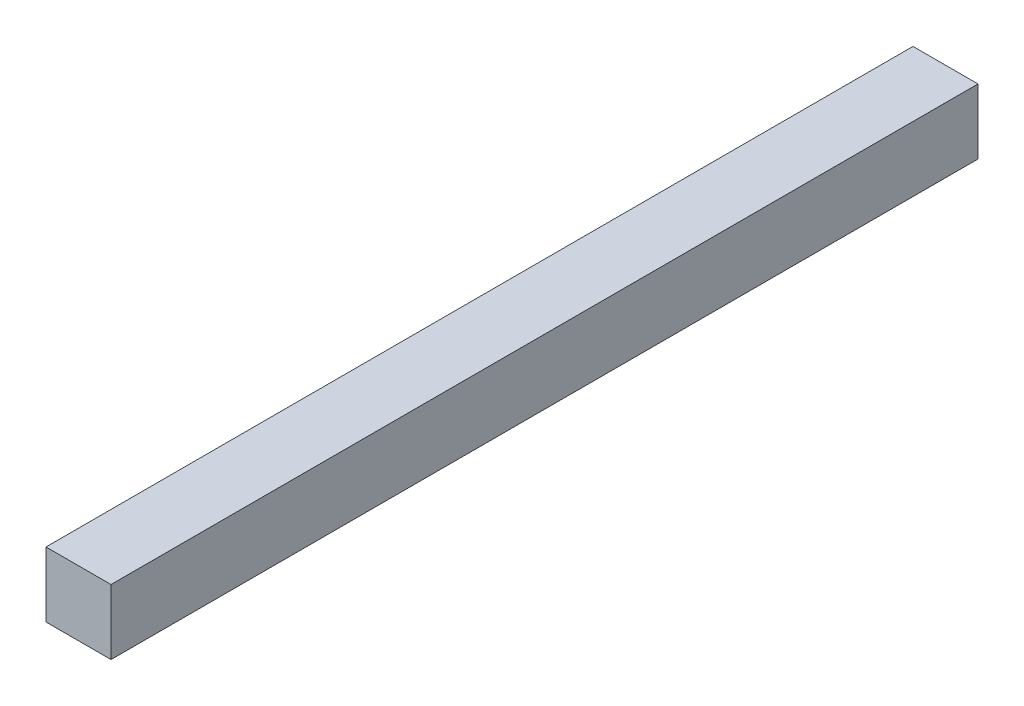
ISO-10303-21;
HEADER;
FILE_DESCRIPTION(('STEP AP214'),'2;1');
FILE_NAME('part.step','',(''),(''),'','','');
FILE_SCHEMA(('AUTOMOTIVE_DESIGN { 1 0 10303 214 1 1 1 1 }'));
ENDSEC;
DATA;
#1=APPLICATION_CONTEXT('core data for automotive mechanical design processes');
#2=APPLICATION_PROTOCOL_DEFINITION('international standard','automotive_design',2000,#1);
#3=PRODUCT_CONTEXT('',#1,'mechanical');
#4=PRODUCT('Part','Part','',(#3));
#5=PRODUCT_RELATED_PRODUCT_CATEGORY('part','',(#4));
#6=PRODUCT_DEFINITION_FORMATION('','',#4);
#7=PRODUCT_DEFINITION_CONTEXT('part definition',#1,'design');
#8=PRODUCT_DEFINITION('design','',#6,#7);
#9=PRODUCT_DEFINITION_SHAPE('','',#8);
#10=(LENGTH_UNIT() NAMED_UNIT(*) SI_UNIT(.MILLI.,.METRE.));
#11=(NAMED_UNIT(*) PLANE_ANGLE_UNIT() SI_UNIT($,.RADIAN.));
#12=(NAMED_UNIT(*) SI_UNIT($,.STERADIAN.) SOLID_ANGLE_UNIT());
#13=UNCERTAINTY_MEASURE_WITH_UNIT(LENGTH_MEASURE(1.E-05),#10,'distance_accuracy_value','');
#14=(GEOMETRIC_REPRESENTATION_CONTEXT(3) GLOBAL_UNCERTAINTY_ASSIGNED_CONTEXT((#13)) GLOBAL_UNIT_ASSIGNED_CONTEXT((#10,
#11,#12)) REPRESENTATION_CONTEXT('',''));
#15=CARTESIAN_POINT('',(0.,0.,0.));
#16=DIRECTION('',(0.,0.,1.));
#17=DIRECTION('',(1.,0.,0.));
#18=AXIS2_PLACEMENT_3D('',#15,#16,#17);
#19=CARTESIAN_POINT('',(15.,15.,200.));
#20=DIRECTION('',(-1.,0.,0.));
#21=DIRECTION('',(0.,0.,1.));
#22=AXIS2_PLACEMENT_3D('',#19,#20,#21);
#23=PLANE('',#22);
#24=DIRECTION('',(0.,1.,0.));
#25=VECTOR('',#24,1.);
#26=CARTESIAN_POINT('',(15.,15.,-200.));
#27=LINE('',#26,#25);
#28=CARTESIAN_POINT('',(15.,-15.,-200.));
#29=VERTEX_POINT('',#28);
#30=CARTESIAN_POINT('',(15.,15.,-200.));
#31=VERTEX_POINT('',#30);
#32=EDGE_CURVE('E98',#29,#31,#27,.T.);
#33=ORIENTED_EDGE('',*,*,#32,.T.);
#34=DIRECTION('',(0.,0.,-1.));
#35=VECTOR('',#34,1.);
#36=CARTESIAN_POINT('',(15.,15.,200.));
#37=LINE('',#36,#35);
#38=CARTESIAN_POINT('',(15.,15.,200.));
#39=VERTEX_POINT('',#38);
#40=EDGE_CURVE('E11',#39,#31,#37,.T.);
#41=ORIENTED_EDGE('',*,*,#40,.F.);
#42=DIRECTION('',(0.,1.,0.));
#43=VECTOR('',#42,1.);
#44=CARTESIAN_POINT('',(15.,15.,200.));
#45=LINE('',#44,#43);
#46=CARTESIAN_POINT('',(15.,-15.,200.));
#47=VERTEX_POINT('',#46);
#48=EDGE_CURVE('E86',#47,#39,#45,.T.);
#49=ORIENTED_EDGE('',*,*,#48,.F.);
#50=DIRECTION('',(0.,0.,-1.));
#51=VECTOR('',#50,1.);
#52=CARTESIAN_POINT('',(15.,-15.,200.));
#53=LINE('',#52,#51);
#54=EDGE_CURVE('E94',#47,#29,#53,.T.);
#55=ORIENTED_EDGE('',*,*,#54,.T.);
#56=EDGE_LOOP('',(#33,#41,#49,#55));
#57=FACE_BOUND('',#56,.T.);
#58=ADVANCED_FACE('F35',(#57),#23,.F.);
#59=CARTESIAN_POINT('',(-15.,15.,200.));
#60=DIRECTION('',(0.,-1.,0.));
#61=DIRECTION('',(0.,0.,-1.));
#62=AXIS2_PLACEMENT_3D('',#59,#60,#61);
#63=PLANE('',#62);
#64=DIRECTION('',(-1.,0.,0.));
#65=VECTOR('',#64,1.);
#66=CARTESIAN_POINT('',(-15.,15.,-200.));
#67=LINE('',#66,#65);
#68=CARTESIAN_POINT('',(-15.,15.,-200.));
#69=VERTEX_POINT('',#68);
#70=EDGE_CURVE('E90',#31,#69,#67,.T.);
#71=ORIENTED_EDGE('',*,*,#70,.T.);
#72=DIRECTION('',(0.,0.,-1.));
#73=VECTOR('',#72,1.);
#74=CARTESIAN_POINT('',(-15.,15.,200.));
#75=LINE('',#74,#73);
#76=CARTESIAN_POINT('',(-15.,15.,200.));
#77=VERTEX_POINT('',#76);
#78=EDGE_CURVE('E43',#77,#69,#75,.T.);
#79=ORIENTED_EDGE('',*,*,#78,.F.);
#80=DIRECTION('',(-1.,0.,0.));
#81=VECTOR('',#80,1.);
#82=CARTESIAN_POINT('',(-15.,15.,200.));
#83=LINE('',#82,#81);
#84=EDGE_CURVE('E81',#39,#77,#83,.T.);
#85=ORIENTED_EDGE('',*,*,#84,.F.);
#86=ORIENTED_EDGE('',*,*,#40,.T.);
#87=EDGE_LOOP('',(#71,#79,#85,#86));
#88=FACE_BOUND('',#87,.T.);
#89=ADVANCED_FACE('F89',(#88),#63,.F.);
#90=CARTESIAN_POINT('',(-15.,15.,200.));
#91=DIRECTION('',(1.,0.,0.));
#92=DIRECTION('',(0.,0.,-1.));
#93=AXIS2_PLACEMENT_3D('',#90,#91,#92);
#94=PLANE('',#93);
#95=DIRECTION('',(0.,-1.,0.));
#96=VECTOR('',#95,1.);
#97=CARTESIAN_POINT('',(-15.,15.,-200.));
#98=LINE('',#97,#96);
#99=CARTESIAN_POINT('',(-15.,-15.,-200.));
#100=VERTEX_POINT('',#99);
#101=EDGE_CURVE('E68',#69,#100,#98,.T.);
#102=ORIENTED_EDGE('',*,*,#101,.T.);
#103=DIRECTION('',(0.,0.,-1.));
#104=VECTOR('',#103,1.);
#105=CARTESIAN_POINT('',(-15.,-15.,200.));
#106=LINE('',#105,#104);
#107=CARTESIAN_POINT('',(-15.,-15.,200.));
#108=VERTEX_POINT('',#107);
#109=EDGE_CURVE('E91',#108,#100,#106,.T.);
#110=ORIENTED_EDGE('',*,*,#109,.F.);
#111=DIRECTION('',(0.,-1.,0.));
#112=VECTOR('',#111,1.);
#113=CARTESIAN_POINT('',(-15.,15.,200.));
#114=LINE('',#113,#112);
#115=EDGE_CURVE('E84',#77,#108,#114,.T.);
#116=ORIENTED_EDGE('',*,*,#115,.F.);
#117=ORIENTED_EDGE('',*,*,#78,.T.);
#118=EDGE_LOOP('',(#102,#110,#116,#117));
#119=FACE_BOUND('',#118,.T.);
#120=ADVANCED_FACE('F92',(#119),#94,.F.);
#121=CARTESIAN_POINT('',(-15.,-15.,200.));
#122=DIRECTION('',(0.,1.,0.));
#123=DIRECTION('',(0.,0.,1.));
#124=AXIS2_PLACEMENT_3D('',#121,#122,#123);
#125=PLANE('',#124);
#126=DIRECTION('',(1.,0.,0.));
#127=VECTOR('',#126,1.);
#128=CARTESIAN_POINT('',(-15.,-15.,-200.));
#129=LINE('',#128,#127);
#130=EDGE_CURVE('E74',#100,#29,#129,.T.);
#131=ORIENTED_EDGE('',*,*,#130,.T.);
#132=ORIENTED_EDGE('',*,*,#54,.F.);
#133=DIRECTION('',(1.,0.,0.));
#134=VECTOR('',#133,1.);
#135=CARTESIAN_POINT('',(-15.,-15.,200.));
#136=LINE('',#135,#134);
#137=EDGE_CURVE('E51',#108,#47,#136,.T.);
#138=ORIENTED_EDGE('',*,*,#137,.F.);
#139=ORIENTED_EDGE('',*,*,#109,.T.);
#140=EDGE_LOOP('',(#131,#132,#138,#139));
#141=FACE_BOUND('',#140,.T.);
#142=ADVANCED_FACE('F105',(#141),#125,.F.);
#143=CARTESIAN_POINT('',(0.,0.,200.));
#144=DIRECTION('',(0.,0.,1.));
#145=DIRECTION('',(1.,0.,0.));
#146=AXIS2_PLACEMENT_3D('',#143,#144,#145);
#147=PLANE('',#146);
#148=ORIENTED_EDGE('',*,*,#48,.T.);
#149=ORIENTED_EDGE('',*,*,#84,.T.);
#150=ORIENTED_EDGE('',*,*,#115,.T.);
#151=ORIENTED_EDGE('',*,*,#137,.T.);
#152=EDGE_LOOP('',(#148,#149,#150,#151));
#153=FACE_BOUND('',#152,.T.);
#154=ADVANCED_FACE('F82',(#153),#147,.T.);
#155=CARTESIAN_POINT('',(0.,0.,-200.));
#156=DIRECTION('',(0.,0.,1.));
#157=DIRECTION('',(1.,0.,0.));
#158=AXIS2_PLACEMENT_3D('',#155,#156,#157);
#159=PLANE('',#158);
#160=ORIENTED_EDGE('',*,*,#32,.F.);
#161=ORIENTED_EDGE('',*,*,#130,.F.);
#162=ORIENTED_EDGE('',*,*,#101,.F.);
#163=ORIENTED_EDGE('',*,*,#70,.F.);
#164=EDGE_LOOP('',(#160,#161,#162,#163));
#165=FACE_BOUND('',#164,.T.);
#166=ADVANCED_FACE('F108',(#165),#159,.F.);
#167=CLOSED_SHELL('',(#58,#89,#120,#142,#154,#166));
#168=MANIFOLD_SOLID_BREP('B2',#167);
#169=ADVANCED_BREP_SHAPE_REPRESENTATION('',(#18,#168),#14);
#170=SHAPE_DEFINITION_REPRESENTATION(#9,#169);
ENDSEC;
END-ISO-10303-21;
